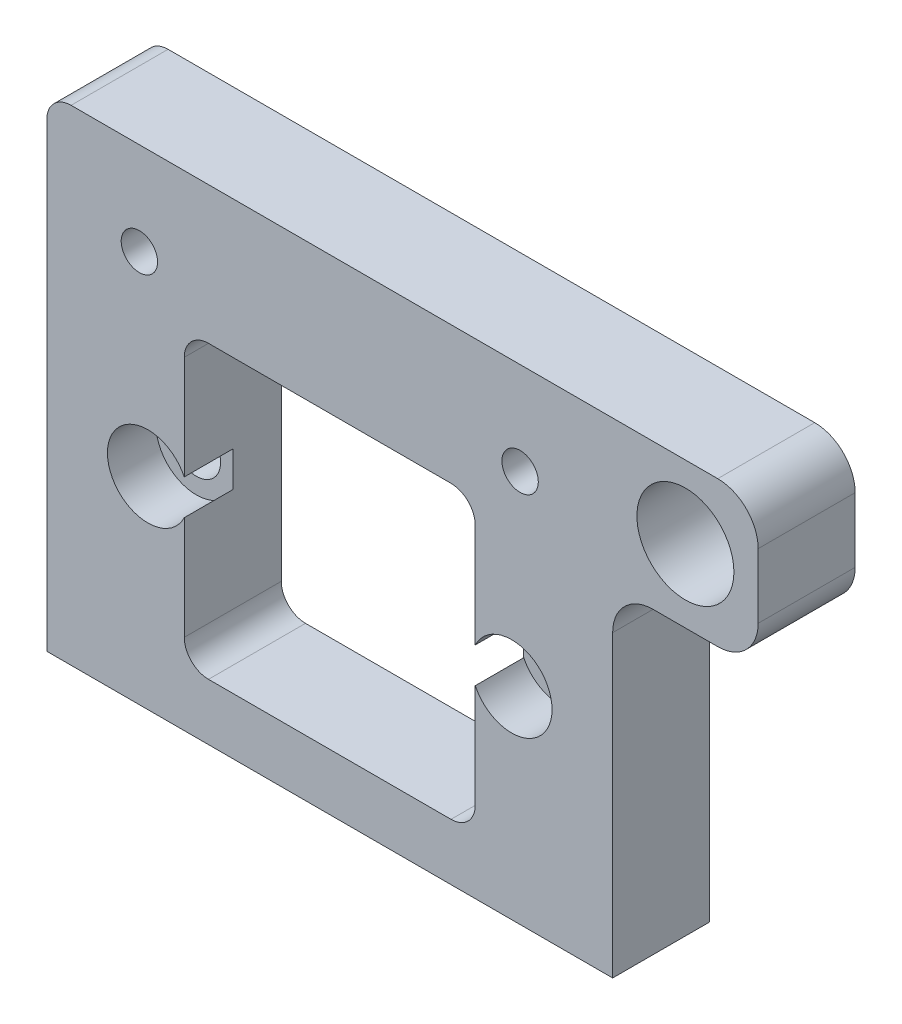
ISO-10303-21;
HEADER;
FILE_DESCRIPTION(('STEP AP214'),'2;1');
FILE_NAME('part.step','',(''),(''),'','','');
FILE_SCHEMA(('AUTOMOTIVE_DESIGN { 1 0 10303 214 1 1 1 1 }'));
ENDSEC;
DATA;
#1=APPLICATION_CONTEXT('core data for automotive mechanical design processes');
#2=APPLICATION_PROTOCOL_DEFINITION('international standard','automotive_design',2000,#1);
#3=PRODUCT_CONTEXT('',#1,'mechanical');
#4=PRODUCT('Part','Part','',(#3));
#5=PRODUCT_RELATED_PRODUCT_CATEGORY('part','',(#4));
#6=PRODUCT_DEFINITION_FORMATION('','',#4);
#7=PRODUCT_DEFINITION_CONTEXT('part definition',#1,'design');
#8=PRODUCT_DEFINITION('design','',#6,#7);
#9=PRODUCT_DEFINITION_SHAPE('','',#8);
#10=(LENGTH_UNIT() NAMED_UNIT(*) SI_UNIT(.MILLI.,.METRE.));
#11=(NAMED_UNIT(*) PLANE_ANGLE_UNIT() SI_UNIT($,.RADIAN.));
#12=(NAMED_UNIT(*) SI_UNIT($,.STERADIAN.) SOLID_ANGLE_UNIT());
#13=UNCERTAINTY_MEASURE_WITH_UNIT(LENGTH_MEASURE(1.E-05),#10,'distance_accuracy_value','');
#14=(GEOMETRIC_REPRESENTATION_CONTEXT(3) GLOBAL_UNCERTAINTY_ASSIGNED_CONTEXT((#13)) GLOBAL_UNIT_ASSIGNED_CONTEXT((#10,
#11,#12)) REPRESENTATION_CONTEXT('',''));
#15=CARTESIAN_POINT('',(0.,0.,0.));
#16=DIRECTION('',(0.,0.,1.));
#17=DIRECTION('',(1.,0.,0.));
#18=AXIS2_PLACEMENT_3D('',#15,#16,#17);
#19=CARTESIAN_POINT('',(57.5,25.,0.));
#20=DIRECTION('',(0.,0.,1.));
#21=DIRECTION('',(1.,0.,0.));
#22=AXIS2_PLACEMENT_3D('',#19,#20,#21);
#23=CYLINDRICAL_SURFACE('',#22,3.);
#24=CARTESIAN_POINT('',(57.5,25.,0.));
#25=DIRECTION('',(0.,0.,1.));
#26=DIRECTION('',(-1.,0.,0.));
#27=AXIS2_PLACEMENT_3D('',#24,#25,#26);
#28=CIRCLE('',#27,3.);
#29=CARTESIAN_POINT('',(54.5,25.,0.));
#30=VERTEX_POINT('',#29);
#31=EDGE_CURVE('E357',#30,#30,#28,.T.);
#32=ORIENTED_EDGE('',*,*,#31,.F.);
#33=EDGE_LOOP('',(#32));
#34=FACE_BOUND('',#33,.T.);
#35=CARTESIAN_POINT('',(57.5,25.,6.));
#36=DIRECTION('',(0.,0.,1.));
#37=DIRECTION('',(1.,0.,0.));
#38=AXIS2_PLACEMENT_3D('',#35,#36,#37);
#39=CIRCLE('',#38,3.);
#40=CARTESIAN_POINT('',(60.5,25.,6.));
#41=VERTEX_POINT('',#40);
#42=EDGE_CURVE('E343',#41,#41,#39,.F.);
#43=ORIENTED_EDGE('',*,*,#42,.F.);
#44=EDGE_LOOP('',(#43));
#45=FACE_BOUND('',#44,.T.);
#46=ADVANCED_FACE('F33',(#34,#45),#23,.F.);
#47=CARTESIAN_POINT('',(12.5,25.,0.));
#48=DIRECTION('',(0.,0.,1.));
#49=DIRECTION('',(1.,0.,0.));
#50=AXIS2_PLACEMENT_3D('',#47,#48,#49);
#51=CYLINDRICAL_SURFACE('',#50,3.);
#52=CARTESIAN_POINT('',(12.5,25.,0.));
#53=DIRECTION('',(0.,0.,1.));
#54=DIRECTION('',(1.,0.,0.));
#55=AXIS2_PLACEMENT_3D('',#52,#53,#54);
#56=CIRCLE('',#55,3.);
#57=CARTESIAN_POINT('',(15.5,25.,0.));
#58=VERTEX_POINT('',#57);
#59=EDGE_CURVE('E218',#58,#58,#56,.T.);
#60=ORIENTED_EDGE('',*,*,#59,.F.);
#61=EDGE_LOOP('',(#60));
#62=FACE_BOUND('',#61,.T.);
#63=CARTESIAN_POINT('',(12.5,25.,6.));
#64=DIRECTION('',(0.,0.,1.));
#65=DIRECTION('',(1.,0.,0.));
#66=AXIS2_PLACEMENT_3D('',#63,#64,#65);
#67=CIRCLE('',#66,3.);
#68=CARTESIAN_POINT('',(15.5,25.,6.));
#69=VERTEX_POINT('',#68);
#70=EDGE_CURVE('E337',#69,#69,#67,.F.);
#71=ORIENTED_EDGE('',*,*,#70,.F.);
#72=EDGE_LOOP('',(#71));
#73=FACE_BOUND('',#72,.T.);
#74=ADVANCED_FACE('F417',(#62,#73),#51,.F.);
#75=CARTESIAN_POINT('',(3.,57.,12.));
#76=DIRECTION('',(0.,0.,1.));
#77=DIRECTION('',(1.,0.,0.));
#78=AXIS2_PLACEMENT_3D('',#75,#76,#77);
#79=PLANE('',#78);
#80=CARTESIAN_POINT('',(58.5500000000392,48.5500000000199,12.));
#81=DIRECTION('',(0.,0.,1.));
#82=DIRECTION('',(1.,0.,0.));
#83=AXIS2_PLACEMENT_3D('',#80,#81,#82);
#84=CIRCLE('',#83,2.25);
#85=CARTESIAN_POINT('',(60.8000000000392,48.5500000000199,12.));
#86=VERTEX_POINT('',#85);
#87=EDGE_CURVE('E449',#86,#86,#84,.T.);
#88=ORIENTED_EDGE('',*,*,#87,.F.);
#89=EDGE_LOOP('',(#88));
#90=FACE_BOUND('',#89,.T.);
#91=CARTESIAN_POINT('',(11.4500000000392,48.5500000000199,12.));
#92=DIRECTION('',(0.,0.,1.));
#93=DIRECTION('',(1.,0.,0.));
#94=AXIS2_PLACEMENT_3D('',#91,#92,#93);
#95=CIRCLE('',#94,2.25);
#96=CARTESIAN_POINT('',(13.7000000000392,48.5500000000199,12.));
#97=VERTEX_POINT('',#96);
#98=EDGE_CURVE('E454',#97,#97,#95,.T.);
#99=ORIENTED_EDGE('',*,*,#98,.F.);
#100=EDGE_LOOP('',(#99));
#101=FACE_BOUND('',#100,.T.);
#102=CARTESIAN_POINT('',(57.5,25.,12.));
#103=DIRECTION('',(0.,0.,1.));
#104=DIRECTION('',(1.,0.,0.));
#105=AXIS2_PLACEMENT_3D('',#102,#103,#104);
#106=CIRCLE('',#105,5.);
#107=CARTESIAN_POINT('',(53.,22.8205505282297,12.));
#108=VERTEX_POINT('',#107);
#109=CARTESIAN_POINT('',(53.,27.1794494717703,12.));
#110=VERTEX_POINT('',#109);
#111=EDGE_CURVE('E180',#108,#110,#106,.T.);
#112=ORIENTED_EDGE('',*,*,#111,.F.);
#113=DIRECTION('',(0.,1.,0.));
#114=VECTOR('',#113,1.);
#115=CARTESIAN_POINT('',(53.,10.,12.));
#116=LINE('',#115,#114);
#117=CARTESIAN_POINT('',(53.,10.,12.));
#118=VERTEX_POINT('',#117);
#119=EDGE_CURVE('E203',#118,#108,#116,.T.);
#120=ORIENTED_EDGE('',*,*,#119,.F.);
#121=CARTESIAN_POINT('',(50.,10.,12.));
#122=DIRECTION('',(0.,0.,1.));
#123=DIRECTION('',(-1.,0.,0.));
#124=AXIS2_PLACEMENT_3D('',#121,#122,#123);
#125=CIRCLE('',#124,3.);
#126=CARTESIAN_POINT('',(50.,7.,12.));
#127=VERTEX_POINT('',#126);
#128=EDGE_CURVE('E204',#127,#118,#125,.T.);
#129=ORIENTED_EDGE('',*,*,#128,.F.);
#130=DIRECTION('',(1.,0.,0.));
#131=VECTOR('',#130,1.);
#132=CARTESIAN_POINT('',(20.,7.,12.));
#133=LINE('',#132,#131);
#134=CARTESIAN_POINT('',(20.,7.,12.));
#135=VERTEX_POINT('',#134);
#136=EDGE_CURVE('E206',#135,#127,#133,.T.);
#137=ORIENTED_EDGE('',*,*,#136,.F.);
#138=CARTESIAN_POINT('',(20.,10.,12.));
#139=DIRECTION('',(0.,0.,1.));
#140=DIRECTION('',(-1.,0.,0.));
#141=AXIS2_PLACEMENT_3D('',#138,#139,#140);
#142=CIRCLE('',#141,3.);
#143=CARTESIAN_POINT('',(17.,10.,12.));
#144=VERTEX_POINT('',#143);
#145=EDGE_CURVE('E367',#144,#135,#142,.T.);
#146=ORIENTED_EDGE('',*,*,#145,.F.);
#147=DIRECTION('',(0.,-1.,0.));
#148=VECTOR('',#147,1.);
#149=CARTESIAN_POINT('',(17.,10.,12.));
#150=LINE('',#149,#148);
#151=CARTESIAN_POINT('',(17.,22.8205505282296,12.));
#152=VERTEX_POINT('',#151);
#153=EDGE_CURVE('E363',#152,#144,#150,.T.);
#154=ORIENTED_EDGE('',*,*,#153,.F.);
#155=CARTESIAN_POINT('',(12.5,25.,12.));
#156=DIRECTION('',(0.,0.,1.));
#157=DIRECTION('',(1.,0.,0.));
#158=AXIS2_PLACEMENT_3D('',#155,#156,#157);
#159=CIRCLE('',#158,5.);
#160=CARTESIAN_POINT('',(17.,27.1794494717704,12.));
#161=VERTEX_POINT('',#160);
#162=EDGE_CURVE('E347',#161,#152,#159,.T.);
#163=ORIENTED_EDGE('',*,*,#162,.F.);
#164=CARTESIAN_POINT('',(17.,40.,12.));
#165=VERTEX_POINT('',#164);
#166=EDGE_CURVE('E364',#165,#161,#150,.T.);
#167=ORIENTED_EDGE('',*,*,#166,.F.);
#168=CARTESIAN_POINT('',(20.,40.,12.));
#169=DIRECTION('',(0.,0.,1.));
#170=DIRECTION('',(-1.,0.,0.));
#171=AXIS2_PLACEMENT_3D('',#168,#169,#170);
#172=CIRCLE('',#171,3.);
#173=CARTESIAN_POINT('',(20.,43.,12.));
#174=VERTEX_POINT('',#173);
#175=EDGE_CURVE('E239',#174,#165,#172,.T.);
#176=ORIENTED_EDGE('',*,*,#175,.F.);
#177=DIRECTION('',(-1.,0.,0.));
#178=VECTOR('',#177,1.);
#179=CARTESIAN_POINT('',(20.,43.,12.));
#180=LINE('',#179,#178);
#181=CARTESIAN_POINT('',(50.,43.,12.));
#182=VERTEX_POINT('',#181);
#183=EDGE_CURVE('E211',#182,#174,#180,.T.);
#184=ORIENTED_EDGE('',*,*,#183,.F.);
#185=CARTESIAN_POINT('',(50.,40.,12.));
#186=DIRECTION('',(0.,0.,1.));
#187=DIRECTION('',(-1.,0.,0.));
#188=AXIS2_PLACEMENT_3D('',#185,#186,#187);
#189=CIRCLE('',#188,3.);
#190=CARTESIAN_POINT('',(53.,40.,12.));
#191=VERTEX_POINT('',#190);
#192=EDGE_CURVE('E202',#191,#182,#189,.T.);
#193=ORIENTED_EDGE('',*,*,#192,.F.);
#194=EDGE_CURVE('E193',#110,#191,#116,.T.);
#195=ORIENTED_EDGE('',*,*,#194,.F.);
#196=EDGE_LOOP('',(#112,#120,#129,#137,#146,#154,#163,#167,#176,#184,#193,#195));
#197=FACE_BOUND('',#196,.T.);
#198=CARTESIAN_POINT('',(79.,51.,12.));
#199=DIRECTION('',(0.,0.,1.));
#200=DIRECTION('',(1.,0.,0.));
#201=AXIS2_PLACEMENT_3D('',#198,#199,#200);
#202=CIRCLE('',#201,6.);
#203=CARTESIAN_POINT('',(85.,51.,12.));
#204=VERTEX_POINT('',#203);
#205=EDGE_CURVE('E258',#204,#204,#202,.T.);
#206=ORIENTED_EDGE('',*,*,#205,.F.);
#207=EDGE_LOOP('',(#206));
#208=FACE_BOUND('',#207,.T.);
#209=DIRECTION('',(0.,-1.,0.));
#210=VECTOR('',#209,1.);
#211=CARTESIAN_POINT('',(0.,0.,12.));
#212=LINE('',#211,#210);
#213=CARTESIAN_POINT('',(0.,57.,12.));
#214=VERTEX_POINT('',#213);
#215=CARTESIAN_POINT('',(0.,0.,12.));
#216=VERTEX_POINT('',#215);
#217=EDGE_CURVE('E264',#214,#216,#212,.T.);
#218=ORIENTED_EDGE('',*,*,#217,.T.);
#219=DIRECTION('',(1.,0.,0.));
#220=VECTOR('',#219,1.);
#221=CARTESIAN_POINT('',(0.,0.,12.));
#222=LINE('',#221,#220);
#223=CARTESIAN_POINT('',(70.,0.,12.));
#224=VERTEX_POINT('',#223);
#225=EDGE_CURVE('E267',#216,#224,#222,.T.);
#226=ORIENTED_EDGE('',*,*,#225,.T.);
#227=DIRECTION('',(0.,1.,0.));
#228=VECTOR('',#227,1.);
#229=CARTESIAN_POINT('',(70.,0.,12.));
#230=LINE('',#229,#228);
#231=CARTESIAN_POINT('',(70.,37.,12.));
#232=VERTEX_POINT('',#231);
#233=EDGE_CURVE('E270',#224,#232,#230,.T.);
#234=ORIENTED_EDGE('',*,*,#233,.T.);
#235=CARTESIAN_POINT('',(75.,37.,12.));
#236=DIRECTION('',(0.,0.,-1.));
#237=DIRECTION('',(-1.,0.,0.));
#238=AXIS2_PLACEMENT_3D('',#235,#236,#237);
#239=CIRCLE('',#238,5.);
#240=CARTESIAN_POINT('',(75.,42.,12.));
#241=VERTEX_POINT('',#240);
#242=EDGE_CURVE('E272',#232,#241,#239,.T.);
#243=ORIENTED_EDGE('',*,*,#242,.T.);
#244=DIRECTION('',(1.,0.,0.));
#245=VECTOR('',#244,1.);
#246=CARTESIAN_POINT('',(75.,42.,12.));
#247=LINE('',#246,#245);
#248=CARTESIAN_POINT('',(83.,42.,12.));
#249=VERTEX_POINT('',#248);
#250=EDGE_CURVE('E274',#241,#249,#247,.T.);
#251=ORIENTED_EDGE('',*,*,#250,.T.);
#252=CARTESIAN_POINT('',(83.,47.,12.));
#253=DIRECTION('',(0.,0.,1.));
#254=DIRECTION('',(1.,0.,0.));
#255=AXIS2_PLACEMENT_3D('',#252,#253,#254);
#256=CIRCLE('',#255,5.);
#257=CARTESIAN_POINT('',(88.,47.,12.));
#258=VERTEX_POINT('',#257);
#259=EDGE_CURVE('E276',#249,#258,#256,.T.);
#260=ORIENTED_EDGE('',*,*,#259,.T.);
#261=DIRECTION('',(0.,1.,0.));
#262=VECTOR('',#261,1.);
#263=CARTESIAN_POINT('',(88.,47.,12.));
#264=LINE('',#263,#262);
#265=CARTESIAN_POINT('',(88.,55.,12.));
#266=VERTEX_POINT('',#265);
#267=EDGE_CURVE('E278',#258,#266,#264,.T.);
#268=ORIENTED_EDGE('',*,*,#267,.T.);
#269=CARTESIAN_POINT('',(83.,55.,12.));
#270=DIRECTION('',(0.,0.,1.));
#271=DIRECTION('',(1.,0.,0.));
#272=AXIS2_PLACEMENT_3D('',#269,#270,#271);
#273=CIRCLE('',#272,5.);
#274=CARTESIAN_POINT('',(83.,60.,12.));
#275=VERTEX_POINT('',#274);
#276=EDGE_CURVE('E280',#266,#275,#273,.T.);
#277=ORIENTED_EDGE('',*,*,#276,.T.);
#278=DIRECTION('',(-1.,0.,0.));
#279=VECTOR('',#278,1.);
#280=CARTESIAN_POINT('',(70.,60.,12.));
#281=LINE('',#280,#279);
#282=CARTESIAN_POINT('',(3.00000000000002,60.,12.));
#283=VERTEX_POINT('',#282);
#284=EDGE_CURVE('E282',#275,#283,#281,.T.);
#285=ORIENTED_EDGE('',*,*,#284,.T.);
#286=CARTESIAN_POINT('',(3.,57.,12.));
#287=DIRECTION('',(0.,0.,1.));
#288=DIRECTION('',(1.,0.,0.));
#289=AXIS2_PLACEMENT_3D('',#286,#287,#288);
#290=CIRCLE('',#289,3.);
#291=EDGE_CURVE('E284',#283,#214,#290,.T.);
#292=ORIENTED_EDGE('',*,*,#291,.T.);
#293=EDGE_LOOP('',(#218,#226,#234,#243,#251,#260,#268,#277,#285,#292));
#294=FACE_BOUND('',#293,.T.);
#295=ADVANCED_FACE('F198',(#90,#101,#197,#208,#294),#79,.T.);
#296=CARTESIAN_POINT('',(3.,57.,0.));
#297=DIRECTION('',(0.,0.,1.));
#298=DIRECTION('',(1.,0.,0.));
#299=AXIS2_PLACEMENT_3D('',#296,#297,#298);
#300=PLANE('',#299);
#301=CARTESIAN_POINT('',(58.5500000000392,48.5500000000199,0.));
#302=DIRECTION('',(0.,0.,1.));
#303=DIRECTION('',(1.,0.,0.));
#304=AXIS2_PLACEMENT_3D('',#301,#302,#303);
#305=CIRCLE('',#304,2.25);
#306=CARTESIAN_POINT('',(60.8000000000392,48.5500000000199,0.));
#307=VERTEX_POINT('',#306);
#308=EDGE_CURVE('E452',#307,#307,#305,.F.);
#309=ORIENTED_EDGE('',*,*,#308,.F.);
#310=EDGE_LOOP('',(#309));
#311=FACE_BOUND('',#310,.T.);
#312=CARTESIAN_POINT('',(11.4500000000392,48.5500000000199,0.));
#313=DIRECTION('',(0.,0.,1.));
#314=DIRECTION('',(1.,0.,0.));
#315=AXIS2_PLACEMENT_3D('',#312,#313,#314);
#316=CIRCLE('',#315,2.25);
#317=CARTESIAN_POINT('',(13.7000000000392,48.5500000000199,0.));
#318=VERTEX_POINT('',#317);
#319=EDGE_CURVE('E189',#318,#318,#316,.F.);
#320=ORIENTED_EDGE('',*,*,#319,.F.);
#321=EDGE_LOOP('',(#320));
#322=FACE_BOUND('',#321,.T.);
#323=ORIENTED_EDGE('',*,*,#31,.T.);
#324=EDGE_LOOP('',(#323));
#325=FACE_BOUND('',#324,.T.);
#326=ORIENTED_EDGE('',*,*,#59,.T.);
#327=EDGE_LOOP('',(#326));
#328=FACE_BOUND('',#327,.T.);
#329=CARTESIAN_POINT('',(79.,51.,0.));
#330=DIRECTION('',(0.,0.,1.));
#331=DIRECTION('',(1.,0.,0.));
#332=AXIS2_PLACEMENT_3D('',#329,#330,#331);
#333=CIRCLE('',#332,6.);
#334=CARTESIAN_POINT('',(85.,51.,0.));
#335=VERTEX_POINT('',#334);
#336=EDGE_CURVE('E257',#335,#335,#333,.T.);
#337=ORIENTED_EDGE('',*,*,#336,.T.);
#338=EDGE_LOOP('',(#337));
#339=FACE_BOUND('',#338,.T.);
#340=DIRECTION('',(0.,-1.,0.));
#341=VECTOR('',#340,1.);
#342=CARTESIAN_POINT('',(0.,0.,0.));
#343=LINE('',#342,#341);
#344=CARTESIAN_POINT('',(0.,57.,0.));
#345=VERTEX_POINT('',#344);
#346=CARTESIAN_POINT('',(0.,0.,0.));
#347=VERTEX_POINT('',#346);
#348=EDGE_CURVE('E261',#345,#347,#343,.T.);
#349=ORIENTED_EDGE('',*,*,#348,.F.);
#350=CARTESIAN_POINT('',(3.,57.,0.));
#351=DIRECTION('',(0.,0.,1.));
#352=DIRECTION('',(1.,0.,0.));
#353=AXIS2_PLACEMENT_3D('',#350,#351,#352);
#354=CIRCLE('',#353,3.);
#355=CARTESIAN_POINT('',(3.00000000000002,60.,0.));
#356=VERTEX_POINT('',#355);
#357=EDGE_CURVE('E268',#356,#345,#354,.T.);
#358=ORIENTED_EDGE('',*,*,#357,.F.);
#359=DIRECTION('',(-1.,0.,0.));
#360=VECTOR('',#359,1.);
#361=CARTESIAN_POINT('',(3.00000000000002,60.,0.));
#362=LINE('',#361,#360);
#363=CARTESIAN_POINT('',(83.,60.,0.));
#364=VERTEX_POINT('',#363);
#365=EDGE_CURVE('E304',#364,#356,#362,.T.);
#366=ORIENTED_EDGE('',*,*,#365,.F.);
#367=CARTESIAN_POINT('',(83.,55.,0.));
#368=DIRECTION('',(0.,0.,1.));
#369=DIRECTION('',(1.,0.,0.));
#370=AXIS2_PLACEMENT_3D('',#367,#368,#369);
#371=CIRCLE('',#370,5.);
#372=CARTESIAN_POINT('',(88.,55.,0.));
#373=VERTEX_POINT('',#372);
#374=EDGE_CURVE('E301',#373,#364,#371,.T.);
#375=ORIENTED_EDGE('',*,*,#374,.F.);
#376=DIRECTION('',(0.,1.,0.));
#377=VECTOR('',#376,1.);
#378=CARTESIAN_POINT('',(88.,47.,0.));
#379=LINE('',#378,#377);
#380=CARTESIAN_POINT('',(88.,47.,0.));
#381=VERTEX_POINT('',#380);
#382=EDGE_CURVE('E299',#381,#373,#379,.T.);
#383=ORIENTED_EDGE('',*,*,#382,.F.);
#384=CARTESIAN_POINT('',(83.,47.,0.));
#385=DIRECTION('',(0.,0.,1.));
#386=DIRECTION('',(1.,0.,0.));
#387=AXIS2_PLACEMENT_3D('',#384,#385,#386);
#388=CIRCLE('',#387,5.);
#389=CARTESIAN_POINT('',(83.,42.,0.));
#390=VERTEX_POINT('',#389);
#391=EDGE_CURVE('E297',#390,#381,#388,.T.);
#392=ORIENTED_EDGE('',*,*,#391,.F.);
#393=DIRECTION('',(1.,0.,0.));
#394=VECTOR('',#393,1.);
#395=CARTESIAN_POINT('',(75.,42.,0.));
#396=LINE('',#395,#394);
#397=CARTESIAN_POINT('',(75.,42.,0.));
#398=VERTEX_POINT('',#397);
#399=EDGE_CURVE('E295',#398,#390,#396,.T.);
#400=ORIENTED_EDGE('',*,*,#399,.F.);
#401=CARTESIAN_POINT('',(75.,37.,0.));
#402=DIRECTION('',(0.,0.,-1.));
#403=DIRECTION('',(-1.,0.,0.));
#404=AXIS2_PLACEMENT_3D('',#401,#402,#403);
#405=CIRCLE('',#404,5.);
#406=CARTESIAN_POINT('',(70.,37.,0.));
#407=VERTEX_POINT('',#406);
#408=EDGE_CURVE('E293',#407,#398,#405,.T.);
#409=ORIENTED_EDGE('',*,*,#408,.F.);
#410=DIRECTION('',(0.,1.,0.));
#411=VECTOR('',#410,1.);
#412=CARTESIAN_POINT('',(70.,0.,0.));
#413=LINE('',#412,#411);
#414=CARTESIAN_POINT('',(70.,0.,0.));
#415=VERTEX_POINT('',#414);
#416=EDGE_CURVE('E291',#415,#407,#413,.T.);
#417=ORIENTED_EDGE('',*,*,#416,.F.);
#418=DIRECTION('',(1.,0.,0.));
#419=VECTOR('',#418,1.);
#420=CARTESIAN_POINT('',(0.,0.,0.));
#421=LINE('',#420,#419);
#422=EDGE_CURVE('E289',#347,#415,#421,.T.);
#423=ORIENTED_EDGE('',*,*,#422,.F.);
#424=EDGE_LOOP('',(#349,#358,#366,#375,#383,#392,#400,#409,#417,#423));
#425=FACE_BOUND('',#424,.T.);
#426=CARTESIAN_POINT('',(20.,40.,0.));
#427=DIRECTION('',(0.,0.,1.));
#428=DIRECTION('',(-1.,0.,0.));
#429=AXIS2_PLACEMENT_3D('',#426,#427,#428);
#430=CIRCLE('',#429,3.);
#431=CARTESIAN_POINT('',(20.,43.,0.));
#432=VERTEX_POINT('',#431);
#433=CARTESIAN_POINT('',(17.,40.,0.));
#434=VERTEX_POINT('',#433);
#435=EDGE_CURVE('E214',#432,#434,#430,.T.);
#436=ORIENTED_EDGE('',*,*,#435,.T.);
#437=DIRECTION('',(0.,-1.,0.));
#438=VECTOR('',#437,1.);
#439=CARTESIAN_POINT('',(17.,10.,0.));
#440=LINE('',#439,#438);
#441=CARTESIAN_POINT('',(17.,10.,0.));
#442=VERTEX_POINT('',#441);
#443=EDGE_CURVE('E217',#434,#442,#440,.T.);
#444=ORIENTED_EDGE('',*,*,#443,.T.);
#445=CARTESIAN_POINT('',(20.,10.,0.));
#446=DIRECTION('',(0.,0.,1.));
#447=DIRECTION('',(-1.,0.,0.));
#448=AXIS2_PLACEMENT_3D('',#445,#446,#447);
#449=CIRCLE('',#448,3.);
#450=CARTESIAN_POINT('',(20.,7.,0.));
#451=VERTEX_POINT('',#450);
#452=EDGE_CURVE('E221',#442,#451,#449,.T.);
#453=ORIENTED_EDGE('',*,*,#452,.T.);
#454=DIRECTION('',(1.,0.,0.));
#455=VECTOR('',#454,1.);
#456=CARTESIAN_POINT('',(20.,7.,0.));
#457=LINE('',#456,#455);
#458=CARTESIAN_POINT('',(50.,7.,0.));
#459=VERTEX_POINT('',#458);
#460=EDGE_CURVE('E224',#451,#459,#457,.T.);
#461=ORIENTED_EDGE('',*,*,#460,.T.);
#462=CARTESIAN_POINT('',(50.,10.,0.));
#463=DIRECTION('',(0.,0.,1.));
#464=DIRECTION('',(-1.,0.,0.));
#465=AXIS2_PLACEMENT_3D('',#462,#463,#464);
#466=CIRCLE('',#465,3.);
#467=CARTESIAN_POINT('',(53.,10.,0.));
#468=VERTEX_POINT('',#467);
#469=EDGE_CURVE('E227',#459,#468,#466,.T.);
#470=ORIENTED_EDGE('',*,*,#469,.T.);
#471=DIRECTION('',(0.,1.,0.));
#472=VECTOR('',#471,1.);
#473=CARTESIAN_POINT('',(53.,10.,0.));
#474=LINE('',#473,#472);
#475=CARTESIAN_POINT('',(53.,40.,0.));
#476=VERTEX_POINT('',#475);
#477=EDGE_CURVE('E230',#468,#476,#474,.T.);
#478=ORIENTED_EDGE('',*,*,#477,.T.);
#479=CARTESIAN_POINT('',(50.,40.,0.));
#480=DIRECTION('',(0.,0.,1.));
#481=DIRECTION('',(-1.,0.,0.));
#482=AXIS2_PLACEMENT_3D('',#479,#480,#481);
#483=CIRCLE('',#482,3.);
#484=CARTESIAN_POINT('',(50.,43.,0.));
#485=VERTEX_POINT('',#484);
#486=EDGE_CURVE('E233',#476,#485,#483,.T.);
#487=ORIENTED_EDGE('',*,*,#486,.T.);
#488=DIRECTION('',(-1.,0.,0.));
#489=VECTOR('',#488,1.);
#490=CARTESIAN_POINT('',(20.,43.,0.));
#491=LINE('',#490,#489);
#492=EDGE_CURVE('E236',#485,#432,#491,.T.);
#493=ORIENTED_EDGE('',*,*,#492,.T.);
#494=EDGE_LOOP('',(#436,#444,#453,#461,#470,#478,#487,#493));
#495=FACE_BOUND('',#494,.T.);
#496=ADVANCED_FACE('F383',(#311,#322,#325,#328,#339,#425,#495),#300,.F.);
#497=CARTESIAN_POINT('',(0.,0.,12.));
#498=DIRECTION('',(1.,0.,0.));
#499=DIRECTION('',(0.,0.,-1.));
#500=AXIS2_PLACEMENT_3D('',#497,#498,#499);
#501=PLANE('',#500);
#502=ORIENTED_EDGE('',*,*,#348,.T.);
#503=DIRECTION('',(0.,0.,-1.));
#504=VECTOR('',#503,1.);
#505=CARTESIAN_POINT('',(0.,0.,12.));
#506=LINE('',#505,#504);
#507=EDGE_CURVE('E333',#216,#347,#506,.T.);
#508=ORIENTED_EDGE('',*,*,#507,.F.);
#509=ORIENTED_EDGE('',*,*,#217,.F.);
#510=DIRECTION('',(0.,0.,-1.));
#511=VECTOR('',#510,1.);
#512=CARTESIAN_POINT('',(0.,57.,12.));
#513=LINE('',#512,#511);
#514=EDGE_CURVE('E286',#214,#345,#513,.T.);
#515=ORIENTED_EDGE('',*,*,#514,.T.);
#516=EDGE_LOOP('',(#502,#508,#509,#515));
#517=FACE_BOUND('',#516,.T.);
#518=ADVANCED_FACE('F35',(#517),#501,.F.);
#519=CARTESIAN_POINT('',(0.,0.,12.));
#520=DIRECTION('',(0.,1.,0.));
#521=DIRECTION('',(0.,0.,1.));
#522=AXIS2_PLACEMENT_3D('',#519,#520,#521);
#523=PLANE('',#522);
#524=ORIENTED_EDGE('',*,*,#422,.T.);
#525=DIRECTION('',(0.,0.,-1.));
#526=VECTOR('',#525,1.);
#527=CARTESIAN_POINT('',(70.,0.,12.));
#528=LINE('',#527,#526);
#529=EDGE_CURVE('E330',#224,#415,#528,.T.);
#530=ORIENTED_EDGE('',*,*,#529,.F.);
#531=ORIENTED_EDGE('',*,*,#225,.F.);
#532=ORIENTED_EDGE('',*,*,#507,.T.);
#533=EDGE_LOOP('',(#524,#530,#531,#532));
#534=FACE_BOUND('',#533,.T.);
#535=ADVANCED_FACE('F516',(#534),#523,.F.);
#536=CARTESIAN_POINT('',(70.,0.,12.));
#537=DIRECTION('',(-1.,0.,0.));
#538=DIRECTION('',(0.,0.,1.));
#539=AXIS2_PLACEMENT_3D('',#536,#537,#538);
#540=PLANE('',#539);
#541=ORIENTED_EDGE('',*,*,#416,.T.);
#542=DIRECTION('',(0.,0.,-1.));
#543=VECTOR('',#542,1.);
#544=CARTESIAN_POINT('',(70.,37.,12.));
#545=LINE('',#544,#543);
#546=EDGE_CURVE('E327',#232,#407,#545,.T.);
#547=ORIENTED_EDGE('',*,*,#546,.F.);
#548=ORIENTED_EDGE('',*,*,#233,.F.);
#549=ORIENTED_EDGE('',*,*,#529,.T.);
#550=EDGE_LOOP('',(#541,#547,#548,#549));
#551=FACE_BOUND('',#550,.T.);
#552=ADVANCED_FACE('F512',(#551),#540,.F.);
#553=CARTESIAN_POINT('',(75.,37.,12.));
#554=DIRECTION('',(0.,0.,-1.));
#555=DIRECTION('',(-1.,0.,0.));
#556=AXIS2_PLACEMENT_3D('',#553,#554,#555);
#557=CYLINDRICAL_SURFACE('',#556,5.);
#558=ORIENTED_EDGE('',*,*,#408,.T.);
#559=DIRECTION('',(0.,0.,-1.));
#560=VECTOR('',#559,1.);
#561=CARTESIAN_POINT('',(75.,42.,12.));
#562=LINE('',#561,#560);
#563=EDGE_CURVE('E324',#241,#398,#562,.T.);
#564=ORIENTED_EDGE('',*,*,#563,.F.);
#565=ORIENTED_EDGE('',*,*,#242,.F.);
#566=ORIENTED_EDGE('',*,*,#546,.T.);
#567=EDGE_LOOP('',(#558,#564,#565,#566));
#568=FACE_BOUND('',#567,.T.);
#569=ADVANCED_FACE('F509',(#568),#557,.F.);
#570=CARTESIAN_POINT('',(75.,42.,12.));
#571=DIRECTION('',(0.,1.,0.));
#572=DIRECTION('',(0.,0.,1.));
#573=AXIS2_PLACEMENT_3D('',#570,#571,#572);
#574=PLANE('',#573);
#575=ORIENTED_EDGE('',*,*,#399,.T.);
#576=DIRECTION('',(0.,0.,-1.));
#577=VECTOR('',#576,1.);
#578=CARTESIAN_POINT('',(83.,42.,12.));
#579=LINE('',#578,#577);
#580=EDGE_CURVE('E321',#249,#390,#579,.T.);
#581=ORIENTED_EDGE('',*,*,#580,.F.);
#582=ORIENTED_EDGE('',*,*,#250,.F.);
#583=ORIENTED_EDGE('',*,*,#563,.T.);
#584=EDGE_LOOP('',(#575,#581,#582,#583));
#585=FACE_BOUND('',#584,.T.);
#586=ADVANCED_FACE('F505',(#585),#574,.F.);
#587=CARTESIAN_POINT('',(83.,47.,12.));
#588=DIRECTION('',(0.,0.,-1.));
#589=DIRECTION('',(-1.,0.,0.));
#590=AXIS2_PLACEMENT_3D('',#587,#588,#589);
#591=CYLINDRICAL_SURFACE('',#590,5.);
#592=ORIENTED_EDGE('',*,*,#391,.T.);
#593=DIRECTION('',(0.,0.,-1.));
#594=VECTOR('',#593,1.);
#595=CARTESIAN_POINT('',(88.,47.,12.));
#596=LINE('',#595,#594);
#597=EDGE_CURVE('E318',#258,#381,#596,.T.);
#598=ORIENTED_EDGE('',*,*,#597,.F.);
#599=ORIENTED_EDGE('',*,*,#259,.F.);
#600=ORIENTED_EDGE('',*,*,#580,.T.);
#601=EDGE_LOOP('',(#592,#598,#599,#600));
#602=FACE_BOUND('',#601,.T.);
#603=ADVANCED_FACE('F500',(#602),#591,.T.);
#604=CARTESIAN_POINT('',(88.,47.,12.));
#605=DIRECTION('',(-1.,0.,0.));
#606=DIRECTION('',(0.,0.,1.));
#607=AXIS2_PLACEMENT_3D('',#604,#605,#606);
#608=PLANE('',#607);
#609=ORIENTED_EDGE('',*,*,#382,.T.);
#610=DIRECTION('',(0.,0.,-1.));
#611=VECTOR('',#610,1.);
#612=CARTESIAN_POINT('',(88.,55.,12.));
#613=LINE('',#612,#611);
#614=EDGE_CURVE('E315',#266,#373,#613,.T.);
#615=ORIENTED_EDGE('',*,*,#614,.F.);
#616=ORIENTED_EDGE('',*,*,#267,.F.);
#617=ORIENTED_EDGE('',*,*,#597,.T.);
#618=EDGE_LOOP('',(#609,#615,#616,#617));
#619=FACE_BOUND('',#618,.T.);
#620=ADVANCED_FACE('F494',(#619),#608,.F.);
#621=CARTESIAN_POINT('',(83.,55.,12.));
#622=DIRECTION('',(0.,0.,-1.));
#623=DIRECTION('',(-1.,0.,0.));
#624=AXIS2_PLACEMENT_3D('',#621,#622,#623);
#625=CYLINDRICAL_SURFACE('',#624,5.);
#626=ORIENTED_EDGE('',*,*,#374,.T.);
#627=DIRECTION('',(0.,0.,-1.));
#628=VECTOR('',#627,1.);
#629=CARTESIAN_POINT('',(83.,60.,12.));
#630=LINE('',#629,#628);
#631=EDGE_CURVE('E312',#275,#364,#630,.T.);
#632=ORIENTED_EDGE('',*,*,#631,.F.);
#633=ORIENTED_EDGE('',*,*,#276,.F.);
#634=ORIENTED_EDGE('',*,*,#614,.T.);
#635=EDGE_LOOP('',(#626,#632,#633,#634));
#636=FACE_BOUND('',#635,.T.);
#637=ADVANCED_FACE('F489',(#636),#625,.T.);
#638=CARTESIAN_POINT('',(3.00000000000002,60.,12.));
#639=DIRECTION('',(0.,-1.,0.));
#640=DIRECTION('',(0.,0.,-1.));
#641=AXIS2_PLACEMENT_3D('',#638,#639,#640);
#642=PLANE('',#641);
#643=ORIENTED_EDGE('',*,*,#365,.T.);
#644=DIRECTION('',(0.,0.,-1.));
#645=VECTOR('',#644,1.);
#646=CARTESIAN_POINT('',(3.00000000000002,60.,12.));
#647=LINE('',#646,#645);
#648=EDGE_CURVE('E309',#283,#356,#647,.T.);
#649=ORIENTED_EDGE('',*,*,#648,.F.);
#650=ORIENTED_EDGE('',*,*,#284,.F.);
#651=ORIENTED_EDGE('',*,*,#631,.T.);
#652=EDGE_LOOP('',(#643,#649,#650,#651));
#653=FACE_BOUND('',#652,.T.);
#654=ADVANCED_FACE('F484',(#653),#642,.F.);
#655=CARTESIAN_POINT('',(3.,57.,12.));
#656=DIRECTION('',(0.,0.,-1.));
#657=DIRECTION('',(-1.,0.,0.));
#658=AXIS2_PLACEMENT_3D('',#655,#656,#657);
#659=CYLINDRICAL_SURFACE('',#658,3.);
#660=ORIENTED_EDGE('',*,*,#357,.T.);
#661=ORIENTED_EDGE('',*,*,#514,.F.);
#662=ORIENTED_EDGE('',*,*,#291,.F.);
#663=ORIENTED_EDGE('',*,*,#648,.T.);
#664=EDGE_LOOP('',(#660,#661,#662,#663));
#665=FACE_BOUND('',#664,.T.);
#666=ADVANCED_FACE('F480',(#665),#659,.T.);
#667=CARTESIAN_POINT('',(79.,51.,12.));
#668=DIRECTION('',(0.,0.,-1.));
#669=DIRECTION('',(-1.,0.,0.));
#670=AXIS2_PLACEMENT_3D('',#667,#668,#669);
#671=CYLINDRICAL_SURFACE('',#670,6.);
#672=ORIENTED_EDGE('',*,*,#205,.T.);
#673=EDGE_LOOP('',(#672));
#674=FACE_BOUND('',#673,.T.);
#675=ORIENTED_EDGE('',*,*,#336,.F.);
#676=EDGE_LOOP('',(#675));
#677=FACE_BOUND('',#676,.T.);
#678=ADVANCED_FACE('F525',(#674,#677),#671,.F.);
#679=CARTESIAN_POINT('',(20.,40.,12.));
#680=DIRECTION('',(0.,0.,-1.));
#681=DIRECTION('',(-1.,0.,0.));
#682=AXIS2_PLACEMENT_3D('',#679,#680,#681);
#683=CYLINDRICAL_SURFACE('',#682,3.);
#684=ORIENTED_EDGE('',*,*,#435,.F.);
#685=DIRECTION('',(0.,0.,-1.));
#686=VECTOR('',#685,1.);
#687=CARTESIAN_POINT('',(20.,43.,12.));
#688=LINE('',#687,#686);
#689=EDGE_CURVE('E213',#174,#432,#688,.T.);
#690=ORIENTED_EDGE('',*,*,#689,.F.);
#691=ORIENTED_EDGE('',*,*,#175,.T.);
#692=DIRECTION('',(0.,0.,-1.));
#693=VECTOR('',#692,1.);
#694=CARTESIAN_POINT('',(17.,40.,12.));
#695=LINE('',#694,#693);
#696=EDGE_CURVE('E254',#165,#434,#695,.T.);
#697=ORIENTED_EDGE('',*,*,#696,.T.);
#698=EDGE_LOOP('',(#684,#690,#691,#697));
#699=FACE_BOUND('',#698,.T.);
#700=ADVANCED_FACE('F401',(#699),#683,.F.);
#701=CARTESIAN_POINT('',(17.,10.,12.));
#702=DIRECTION('',(1.,0.,0.));
#703=DIRECTION('',(0.,0.,-1.));
#704=AXIS2_PLACEMENT_3D('',#701,#702,#703);
#705=PLANE('',#704);
#706=DIRECTION('',(0.,0.,1.));
#707=VECTOR('',#706,1.);
#708=CARTESIAN_POINT('',(17.,27.1794494717704,6.));
#709=LINE('',#708,#707);
#710=CARTESIAN_POINT('',(17.,27.1794494717704,6.));
#711=VERTEX_POINT('',#710);
#712=EDGE_CURVE('E196',#711,#161,#709,.T.);
#713=ORIENTED_EDGE('',*,*,#712,.F.);
#714=DIRECTION('',(0.,-1.,0.));
#715=VECTOR('',#714,1.);
#716=CARTESIAN_POINT('',(17.,10.,6.));
#717=LINE('',#716,#715);
#718=CARTESIAN_POINT('',(17.,22.8205505282296,6.));
#719=VERTEX_POINT('',#718);
#720=EDGE_CURVE('E340',#711,#719,#717,.T.);
#721=ORIENTED_EDGE('',*,*,#720,.T.);
#722=DIRECTION('',(0.,0.,1.));
#723=VECTOR('',#722,1.);
#724=CARTESIAN_POINT('',(17.,22.8205505282296,6.));
#725=LINE('',#724,#723);
#726=EDGE_CURVE('E336',#152,#719,#725,.F.);
#727=ORIENTED_EDGE('',*,*,#726,.F.);
#728=ORIENTED_EDGE('',*,*,#153,.T.);
#729=DIRECTION('',(0.,0.,-1.));
#730=VECTOR('',#729,1.);
#731=CARTESIAN_POINT('',(17.,10.,12.));
#732=LINE('',#731,#730);
#733=EDGE_CURVE('E252',#144,#442,#732,.T.);
#734=ORIENTED_EDGE('',*,*,#733,.T.);
#735=ORIENTED_EDGE('',*,*,#443,.F.);
#736=ORIENTED_EDGE('',*,*,#696,.F.);
#737=ORIENTED_EDGE('',*,*,#166,.T.);
#738=EDGE_LOOP('',(#713,#721,#727,#728,#734,#735,#736,#737));
#739=FACE_BOUND('',#738,.T.);
#740=ADVANCED_FACE('F394',(#739),#705,.T.);
#741=CARTESIAN_POINT('',(20.,10.,12.));
#742=DIRECTION('',(0.,0.,-1.));
#743=DIRECTION('',(-1.,0.,0.));
#744=AXIS2_PLACEMENT_3D('',#741,#742,#743);
#745=CYLINDRICAL_SURFACE('',#744,3.);
#746=ORIENTED_EDGE('',*,*,#452,.F.);
#747=ORIENTED_EDGE('',*,*,#733,.F.);
#748=ORIENTED_EDGE('',*,*,#145,.T.);
#749=DIRECTION('',(0.,0.,-1.));
#750=VECTOR('',#749,1.);
#751=CARTESIAN_POINT('',(20.,7.,12.));
#752=LINE('',#751,#750);
#753=EDGE_CURVE('E250',#135,#451,#752,.T.);
#754=ORIENTED_EDGE('',*,*,#753,.T.);
#755=EDGE_LOOP('',(#746,#747,#748,#754));
#756=FACE_BOUND('',#755,.T.);
#757=ADVANCED_FACE('F387',(#756),#745,.F.);
#758=CARTESIAN_POINT('',(20.,7.,12.));
#759=DIRECTION('',(0.,1.,0.));
#760=DIRECTION('',(-1.,0.,0.));
#761=AXIS2_PLACEMENT_3D('',#758,#759,#760);
#762=PLANE('',#761);
#763=ORIENTED_EDGE('',*,*,#460,.F.);
#764=ORIENTED_EDGE('',*,*,#753,.F.);
#765=ORIENTED_EDGE('',*,*,#136,.T.);
#766=DIRECTION('',(0.,0.,-1.));
#767=VECTOR('',#766,1.);
#768=CARTESIAN_POINT('',(50.,7.,12.));
#769=LINE('',#768,#767);
#770=EDGE_CURVE('E248',#127,#459,#769,.T.);
#771=ORIENTED_EDGE('',*,*,#770,.T.);
#772=EDGE_LOOP('',(#763,#764,#765,#771));
#773=FACE_BOUND('',#772,.T.);
#774=ADVANCED_FACE('F373',(#773),#762,.T.);
#775=CARTESIAN_POINT('',(50.,10.,12.));
#776=DIRECTION('',(0.,0.,-1.));
#777=DIRECTION('',(-1.,0.,0.));
#778=AXIS2_PLACEMENT_3D('',#775,#776,#777);
#779=CYLINDRICAL_SURFACE('',#778,3.);
#780=ORIENTED_EDGE('',*,*,#469,.F.);
#781=ORIENTED_EDGE('',*,*,#770,.F.);
#782=ORIENTED_EDGE('',*,*,#128,.T.);
#783=DIRECTION('',(0.,0.,-1.));
#784=VECTOR('',#783,1.);
#785=CARTESIAN_POINT('',(53.,10.,12.));
#786=LINE('',#785,#784);
#787=EDGE_CURVE('E246',#118,#468,#786,.T.);
#788=ORIENTED_EDGE('',*,*,#787,.T.);
#789=EDGE_LOOP('',(#780,#781,#782,#788));
#790=FACE_BOUND('',#789,.T.);
#791=ADVANCED_FACE('F378',(#790),#779,.F.);
#792=CARTESIAN_POINT('',(53.,10.,12.));
#793=DIRECTION('',(-1.,0.,0.));
#794=DIRECTION('',(0.,-1.,0.));
#795=AXIS2_PLACEMENT_3D('',#792,#793,#794);
#796=PLANE('',#795);
#797=DIRECTION('',(0.,0.,1.));
#798=VECTOR('',#797,1.);
#799=CARTESIAN_POINT('',(53.,22.8205505282297,6.));
#800=LINE('',#799,#798);
#801=CARTESIAN_POINT('',(53.,22.8205505282297,6.));
#802=VERTEX_POINT('',#801);
#803=EDGE_CURVE('E11',#802,#108,#800,.T.);
#804=ORIENTED_EDGE('',*,*,#803,.F.);
#805=DIRECTION('',(0.,1.,0.));
#806=VECTOR('',#805,1.);
#807=CARTESIAN_POINT('',(53.,10.,6.));
#808=LINE('',#807,#806);
#809=CARTESIAN_POINT('',(53.,27.1794494717703,6.));
#810=VERTEX_POINT('',#809);
#811=EDGE_CURVE('E195',#802,#810,#808,.T.);
#812=ORIENTED_EDGE('',*,*,#811,.T.);
#813=DIRECTION('',(0.,0.,1.));
#814=VECTOR('',#813,1.);
#815=CARTESIAN_POINT('',(53.,27.1794494717703,6.));
#816=LINE('',#815,#814);
#817=EDGE_CURVE('E41',#110,#810,#816,.F.);
#818=ORIENTED_EDGE('',*,*,#817,.F.);
#819=ORIENTED_EDGE('',*,*,#194,.T.);
#820=DIRECTION('',(0.,0.,-1.));
#821=VECTOR('',#820,1.);
#822=CARTESIAN_POINT('',(53.,40.,12.));
#823=LINE('',#822,#821);
#824=EDGE_CURVE('E244',#191,#476,#823,.T.);
#825=ORIENTED_EDGE('',*,*,#824,.T.);
#826=ORIENTED_EDGE('',*,*,#477,.F.);
#827=ORIENTED_EDGE('',*,*,#787,.F.);
#828=ORIENTED_EDGE('',*,*,#119,.T.);
#829=EDGE_LOOP('',(#804,#812,#818,#819,#825,#826,#827,#828));
#830=FACE_BOUND('',#829,.T.);
#831=ADVANCED_FACE('F192',(#830),#796,.T.);
#832=CARTESIAN_POINT('',(50.,40.,12.));
#833=DIRECTION('',(0.,0.,-1.));
#834=DIRECTION('',(-1.,0.,0.));
#835=AXIS2_PLACEMENT_3D('',#832,#833,#834);
#836=CYLINDRICAL_SURFACE('',#835,3.);
#837=ORIENTED_EDGE('',*,*,#486,.F.);
#838=ORIENTED_EDGE('',*,*,#824,.F.);
#839=ORIENTED_EDGE('',*,*,#192,.T.);
#840=DIRECTION('',(0.,0.,-1.));
#841=VECTOR('',#840,1.);
#842=CARTESIAN_POINT('',(50.,43.,12.));
#843=LINE('',#842,#841);
#844=EDGE_CURVE('E242',#182,#485,#843,.T.);
#845=ORIENTED_EDGE('',*,*,#844,.T.);
#846=EDGE_LOOP('',(#837,#838,#839,#845));
#847=FACE_BOUND('',#846,.T.);
#848=ADVANCED_FACE('F406',(#847),#836,.F.);
#849=CARTESIAN_POINT('',(20.,43.,12.));
#850=DIRECTION('',(0.,-1.,0.));
#851=DIRECTION('',(0.,0.,-1.));
#852=AXIS2_PLACEMENT_3D('',#849,#850,#851);
#853=PLANE('',#852);
#854=ORIENTED_EDGE('',*,*,#492,.F.);
#855=ORIENTED_EDGE('',*,*,#844,.F.);
#856=ORIENTED_EDGE('',*,*,#183,.T.);
#857=ORIENTED_EDGE('',*,*,#689,.T.);
#858=EDGE_LOOP('',(#854,#855,#856,#857));
#859=FACE_BOUND('',#858,.T.);
#860=ADVANCED_FACE('F404',(#859),#853,.T.);
#861=CARTESIAN_POINT('',(12.5,25.,6.));
#862=DIRECTION('',(0.,0.,1.));
#863=DIRECTION('',(1.,0.,0.));
#864=AXIS2_PLACEMENT_3D('',#861,#862,#863);
#865=PLANE('',#864);
#866=CARTESIAN_POINT('',(12.5,25.,6.));
#867=DIRECTION('',(0.,0.,1.));
#868=DIRECTION('',(1.,0.,0.));
#869=AXIS2_PLACEMENT_3D('',#866,#867,#868);
#870=CIRCLE('',#869,5.);
#871=EDGE_CURVE('E54',#711,#719,#870,.T.);
#872=ORIENTED_EDGE('',*,*,#871,.T.);
#873=ORIENTED_EDGE('',*,*,#720,.F.);
#874=EDGE_LOOP('',(#872,#873));
#875=FACE_BOUND('',#874,.T.);
#876=ORIENTED_EDGE('',*,*,#70,.T.);
#877=EDGE_LOOP('',(#876));
#878=FACE_BOUND('',#877,.T.);
#879=ADVANCED_FACE('F413',(#875,#878),#865,.T.);
#880=CARTESIAN_POINT('',(12.5,25.,6.));
#881=DIRECTION('',(0.,0.,1.));
#882=DIRECTION('',(1.,0.,0.));
#883=AXIS2_PLACEMENT_3D('',#880,#881,#882);
#884=CYLINDRICAL_SURFACE('',#883,5.);
#885=ORIENTED_EDGE('',*,*,#712,.T.);
#886=ORIENTED_EDGE('',*,*,#162,.T.);
#887=ORIENTED_EDGE('',*,*,#726,.T.);
#888=ORIENTED_EDGE('',*,*,#871,.F.);
#889=EDGE_LOOP('',(#885,#886,#887,#888));
#890=FACE_BOUND('',#889,.T.);
#891=ADVANCED_FACE('F396',(#890),#884,.F.);
#892=CARTESIAN_POINT('',(57.5,25.,6.));
#893=DIRECTION('',(0.,0.,1.));
#894=DIRECTION('',(1.,0.,0.));
#895=AXIS2_PLACEMENT_3D('',#892,#893,#894);
#896=PLANE('',#895);
#897=CARTESIAN_POINT('',(57.5,25.,6.));
#898=DIRECTION('',(0.,0.,1.));
#899=DIRECTION('',(1.,0.,0.));
#900=AXIS2_PLACEMENT_3D('',#897,#898,#899);
#901=CIRCLE('',#900,5.);
#902=EDGE_CURVE('E47',#802,#810,#901,.T.);
#903=ORIENTED_EDGE('',*,*,#902,.T.);
#904=ORIENTED_EDGE('',*,*,#811,.F.);
#905=EDGE_LOOP('',(#903,#904));
#906=FACE_BOUND('',#905,.T.);
#907=ORIENTED_EDGE('',*,*,#42,.T.);
#908=EDGE_LOOP('',(#907));
#909=FACE_BOUND('',#908,.T.);
#910=ADVANCED_FACE('F430',(#906,#909),#896,.T.);
#911=CARTESIAN_POINT('',(57.5,25.,6.));
#912=DIRECTION('',(0.,0.,1.));
#913=DIRECTION('',(1.,0.,0.));
#914=AXIS2_PLACEMENT_3D('',#911,#912,#913);
#915=CYLINDRICAL_SURFACE('',#914,5.);
#916=ORIENTED_EDGE('',*,*,#803,.T.);
#917=ORIENTED_EDGE('',*,*,#111,.T.);
#918=ORIENTED_EDGE('',*,*,#817,.T.);
#919=ORIENTED_EDGE('',*,*,#902,.F.);
#920=EDGE_LOOP('',(#916,#917,#918,#919));
#921=FACE_BOUND('',#920,.T.);
#922=ADVANCED_FACE('F182',(#921),#915,.F.);
#923=CARTESIAN_POINT('',(11.4500000000392,48.5500000000199,-0.000999999999999265));
#924=DIRECTION('',(0.,0.,1.));
#925=DIRECTION('',(1.,0.,0.));
#926=AXIS2_PLACEMENT_3D('',#923,#924,#925);
#927=CYLINDRICAL_SURFACE('',#926,2.25);
#928=ORIENTED_EDGE('',*,*,#98,.T.);
#929=EDGE_LOOP('',(#928));
#930=FACE_BOUND('',#929,.T.);
#931=ORIENTED_EDGE('',*,*,#319,.T.);
#932=EDGE_LOOP('',(#931));
#933=FACE_BOUND('',#932,.T.);
#934=ADVANCED_FACE('F435',(#930,#933),#927,.F.);
#935=CARTESIAN_POINT('',(58.5500000000392,48.5500000000199,-0.000999999999999265));
#936=DIRECTION('',(0.,0.,1.));
#937=DIRECTION('',(1.,0.,0.));
#938=AXIS2_PLACEMENT_3D('',#935,#936,#937);
#939=CYLINDRICAL_SURFACE('',#938,2.25);
#940=ORIENTED_EDGE('',*,*,#87,.T.);
#941=EDGE_LOOP('',(#940));
#942=FACE_BOUND('',#941,.T.);
#943=ORIENTED_EDGE('',*,*,#308,.T.);
#944=EDGE_LOOP('',(#943));
#945=FACE_BOUND('',#944,.T.);
#946=ADVANCED_FACE('F440',(#942,#945),#939,.F.);
#947=CLOSED_SHELL('',(#46,#74,#295,#496,#518,#535,#552,#569,#586,#603,#620,#637,#654,#666,#678,
#700,#740,#757,#774,#791,#831,#848,#860,#879,#891,#910,#922,#934,#946));
#948=MANIFOLD_SOLID_BREP('B2',#947);
#949=ADVANCED_BREP_SHAPE_REPRESENTATION('',(#18,#948),#14);
#950=SHAPE_DEFINITION_REPRESENTATION(#9,#949);
ENDSEC;
END-ISO-10303-21;
